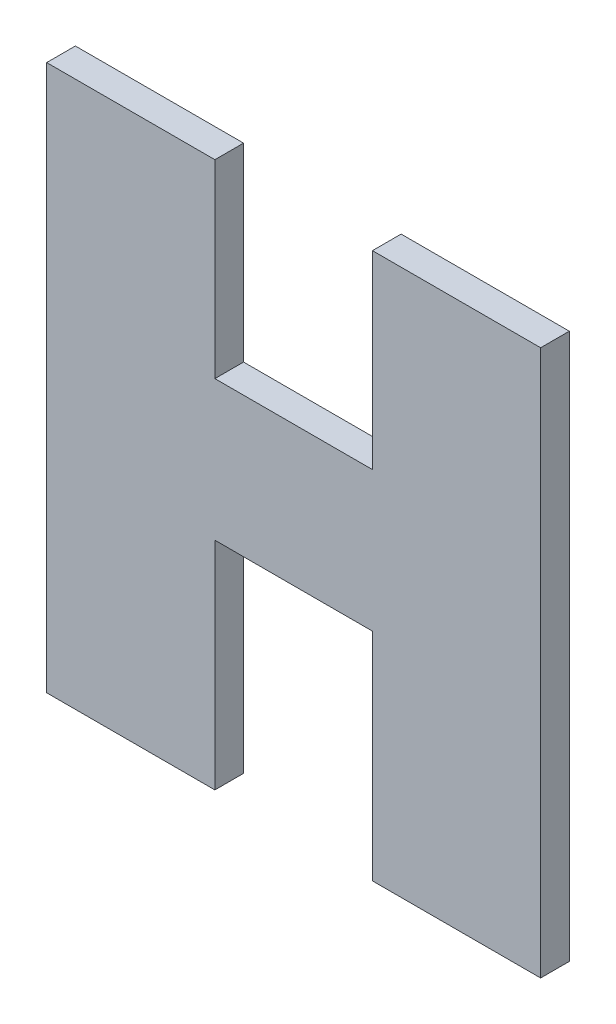
ISO-10303-21;
HEADER;
FILE_DESCRIPTION(('STEP AP214'),'2;1');
FILE_NAME('part.step','',(''),(''),'','','');
FILE_SCHEMA(('AUTOMOTIVE_DESIGN { 1 0 10303 214 1 1 1 1 }'));
ENDSEC;
DATA;
#1=APPLICATION_CONTEXT('core data for automotive mechanical design processes');
#2=APPLICATION_PROTOCOL_DEFINITION('international standard','automotive_design',2000,#1);
#3=PRODUCT_CONTEXT('',#1,'mechanical');
#4=PRODUCT('Part','Part','',(#3));
#5=PRODUCT_RELATED_PRODUCT_CATEGORY('part','',(#4));
#6=PRODUCT_DEFINITION_FORMATION('','',#4);
#7=PRODUCT_DEFINITION_CONTEXT('part definition',#1,'design');
#8=PRODUCT_DEFINITION('design','',#6,#7);
#9=PRODUCT_DEFINITION_SHAPE('','',#8);
#10=(LENGTH_UNIT() NAMED_UNIT(*) SI_UNIT(.MILLI.,.METRE.));
#11=(NAMED_UNIT(*) PLANE_ANGLE_UNIT() SI_UNIT($,.RADIAN.));
#12=(NAMED_UNIT(*) SI_UNIT($,.STERADIAN.) SOLID_ANGLE_UNIT());
#13=UNCERTAINTY_MEASURE_WITH_UNIT(LENGTH_MEASURE(1.E-05),#10,'distance_accuracy_value','');
#14=(GEOMETRIC_REPRESENTATION_CONTEXT(3) GLOBAL_UNCERTAINTY_ASSIGNED_CONTEXT((#13)) GLOBAL_UNIT_ASSIGNED_CONTEXT((#10,
#11,#12)) REPRESENTATION_CONTEXT('',''));
#15=CARTESIAN_POINT('',(0.,0.,0.));
#16=DIRECTION('',(0.,0.,1.));
#17=DIRECTION('',(1.,0.,0.));
#18=AXIS2_PLACEMENT_3D('',#15,#16,#17);
#19=CARTESIAN_POINT('',(0.,0.,0.));
#20=DIRECTION('',(0.,0.,1.));
#21=DIRECTION('',(1.,0.,0.));
#22=AXIS2_PLACEMENT_3D('',#19,#20,#21);
#23=PLANE('',#22);
#24=DIRECTION('',(0.,1.,0.));
#25=VECTOR('',#24,1.);
#26=CARTESIAN_POINT('',(5.04063,-1.367028,0.));
#27=LINE('',#26,#25);
#28=CARTESIAN_POINT('',(5.04063,-1.367028,0.));
#29=VERTEX_POINT('',#28);
#30=CARTESIAN_POINT('',(5.04063,-1.743964,0.));
#31=VERTEX_POINT('',#30);
#32=EDGE_CURVE('E162',#29,#31,#27,.F.);
#33=ORIENTED_EDGE('',*,*,#32,.F.);
#34=DIRECTION('',(1.,0.,0.));
#35=VECTOR('',#34,1.);
#36=CARTESIAN_POINT('',(4.766056,-1.367028,0.));
#37=LINE('',#36,#35);
#38=CARTESIAN_POINT('',(4.766056,-1.367028,0.));
#39=VERTEX_POINT('',#38);
#40=EDGE_CURVE('E157',#39,#29,#37,.T.);
#41=ORIENTED_EDGE('',*,*,#40,.F.);
#42=DIRECTION('',(0.,1.,0.));
#43=VECTOR('',#42,1.);
#44=CARTESIAN_POINT('',(4.766056,-1.743964,0.));
#45=LINE('',#44,#43);
#46=CARTESIAN_POINT('',(4.766056,-1.743964,0.));
#47=VERTEX_POINT('',#46);
#48=EDGE_CURVE('E152',#47,#39,#45,.T.);
#49=ORIENTED_EDGE('',*,*,#48,.F.);
#50=DIRECTION('',(1.,0.,0.));
#51=VECTOR('',#50,1.);
#52=CARTESIAN_POINT('',(4.47294,-1.743964,0.));
#53=LINE('',#52,#51);
#54=CARTESIAN_POINT('',(4.47294,-1.743964,0.));
#55=VERTEX_POINT('',#54);
#56=EDGE_CURVE('E147',#55,#47,#53,.T.);
#57=ORIENTED_EDGE('',*,*,#56,.F.);
#58=DIRECTION('',(0.,1.,0.));
#59=VECTOR('',#58,1.);
#60=CARTESIAN_POINT('',(4.47294,-0.792734,0.));
#61=LINE('',#60,#59);
#62=CARTESIAN_POINT('',(4.47294,-0.792734,0.));
#63=VERTEX_POINT('',#62);
#64=EDGE_CURVE('E142',#63,#55,#61,.F.);
#65=ORIENTED_EDGE('',*,*,#64,.F.);
#66=DIRECTION('',(1.,0.,0.));
#67=VECTOR('',#66,1.);
#68=CARTESIAN_POINT('',(4.766056,-0.792734,0.));
#69=LINE('',#68,#67);
#70=CARTESIAN_POINT('',(4.766056,-0.792734,0.));
#71=VERTEX_POINT('',#70);
#72=EDGE_CURVE('E137',#71,#63,#69,.F.);
#73=ORIENTED_EDGE('',*,*,#72,.F.);
#74=DIRECTION('',(0.,1.,0.));
#75=VECTOR('',#74,1.);
#76=CARTESIAN_POINT('',(4.766056,-1.123188,0.));
#77=LINE('',#76,#75);
#78=CARTESIAN_POINT('',(4.766056,-1.123188,0.));
#79=VERTEX_POINT('',#78);
#80=EDGE_CURVE('E132',#79,#71,#77,.T.);
#81=ORIENTED_EDGE('',*,*,#80,.F.);
#82=DIRECTION('',(1.,0.,0.));
#83=VECTOR('',#82,1.);
#84=CARTESIAN_POINT('',(5.04063,-1.123188,0.));
#85=LINE('',#84,#83);
#86=CARTESIAN_POINT('',(5.04063,-1.123188,0.));
#87=VERTEX_POINT('',#86);
#88=EDGE_CURVE('E118',#87,#79,#85,.F.);
#89=ORIENTED_EDGE('',*,*,#88,.F.);
#90=DIRECTION('',(0.,1.,0.));
#91=VECTOR('',#90,1.);
#92=CARTESIAN_POINT('',(5.04063,-0.792734,0.));
#93=LINE('',#92,#91);
#94=CARTESIAN_POINT('',(5.04063,-0.792734,0.));
#95=VERTEX_POINT('',#94);
#96=EDGE_CURVE('E103',#95,#87,#93,.F.);
#97=ORIENTED_EDGE('',*,*,#96,.F.);
#98=DIRECTION('',(1.,0.,0.));
#99=VECTOR('',#98,1.);
#100=CARTESIAN_POINT('',(5.333746,-0.792734,0.));
#101=LINE('',#100,#99);
#102=CARTESIAN_POINT('',(5.333746,-0.792734,0.));
#103=VERTEX_POINT('',#102);
#104=EDGE_CURVE('E20',#103,#95,#101,.F.);
#105=ORIENTED_EDGE('',*,*,#104,.F.);
#106=DIRECTION('',(0.,1.,0.));
#107=VECTOR('',#106,1.);
#108=CARTESIAN_POINT('',(5.333746,-1.743964,0.));
#109=LINE('',#108,#107);
#110=CARTESIAN_POINT('',(5.333746,-1.743964,0.));
#111=VERTEX_POINT('',#110);
#112=EDGE_CURVE('E171',#111,#103,#109,.T.);
#113=ORIENTED_EDGE('',*,*,#112,.F.);
#114=DIRECTION('',(1.,0.,0.));
#115=VECTOR('',#114,1.);
#116=CARTESIAN_POINT('',(5.04063,-1.743964,0.));
#117=LINE('',#116,#115);
#118=EDGE_CURVE('E167',#31,#111,#117,.T.);
#119=ORIENTED_EDGE('',*,*,#118,.F.);
#120=EDGE_LOOP('',(#33,#41,#49,#57,#65,#73,#81,#89,#97,#105,#113,#119));
#121=FACE_BOUND('',#120,.T.);
#122=ADVANCED_FACE('F17',(#121),#23,.F.);
#123=CARTESIAN_POINT('',(5.333746,-0.792734,0.));
#124=DIRECTION('',(0.,1.,0.));
#125=DIRECTION('',(0.,0.,1.));
#126=AXIS2_PLACEMENT_3D('',#123,#124,#125);
#127=PLANE('',#126);
#128=DIRECTION('',(0.,0.,-1.));
#129=VECTOR('',#128,1.);
#130=CARTESIAN_POINT('',(5.333746,-0.792734,0.));
#131=LINE('',#130,#129);
#132=CARTESIAN_POINT('',(5.333746,-0.792734,0.05));
#133=VERTEX_POINT('',#132);
#134=EDGE_CURVE('E112',#103,#133,#131,.F.);
#135=ORIENTED_EDGE('',*,*,#134,.F.);
#136=ORIENTED_EDGE('',*,*,#104,.T.);
#137=DIRECTION('',(0.,0.,1.));
#138=VECTOR('',#137,1.);
#139=CARTESIAN_POINT('',(5.04063,-0.792734,0.));
#140=LINE('',#139,#138);
#141=CARTESIAN_POINT('',(5.04063,-0.792734,0.05));
#142=VERTEX_POINT('',#141);
#143=EDGE_CURVE('E109',#142,#95,#140,.F.);
#144=ORIENTED_EDGE('',*,*,#143,.F.);
#145=DIRECTION('',(1.,0.,0.));
#146=VECTOR('',#145,1.);
#147=CARTESIAN_POINT('',(0.,-0.792734,0.05));
#148=LINE('',#147,#146);
#149=EDGE_CURVE('E173',#133,#142,#148,.F.);
#150=ORIENTED_EDGE('',*,*,#149,.F.);
#151=EDGE_LOOP('',(#135,#136,#144,#150));
#152=FACE_BOUND('',#151,.T.);
#153=ADVANCED_FACE('F108',(#152),#127,.T.);
#154=CARTESIAN_POINT('',(5.04063,-0.792734,0.));
#155=DIRECTION('',(-1.,0.,0.));
#156=DIRECTION('',(0.,0.,1.));
#157=AXIS2_PLACEMENT_3D('',#154,#155,#156);
#158=PLANE('',#157);
#159=ORIENTED_EDGE('',*,*,#143,.T.);
#160=ORIENTED_EDGE('',*,*,#96,.T.);
#161=DIRECTION('',(0.,0.,1.));
#162=VECTOR('',#161,1.);
#163=CARTESIAN_POINT('',(5.04063,-1.123188,0.));
#164=LINE('',#163,#162);
#165=CARTESIAN_POINT('',(5.04063,-1.123188,0.05));
#166=VERTEX_POINT('',#165);
#167=EDGE_CURVE('E120',#166,#87,#164,.F.);
#168=ORIENTED_EDGE('',*,*,#167,.F.);
#169=DIRECTION('',(0.,1.,0.));
#170=VECTOR('',#169,1.);
#171=CARTESIAN_POINT('',(5.04063,0.,0.05));
#172=LINE('',#171,#170);
#173=EDGE_CURVE('E124',#142,#166,#172,.F.);
#174=ORIENTED_EDGE('',*,*,#173,.F.);
#175=EDGE_LOOP('',(#159,#160,#168,#174));
#176=FACE_BOUND('',#175,.T.);
#177=ADVANCED_FACE('F122',(#176),#158,.T.);
#178=CARTESIAN_POINT('',(5.04063,-1.123188,0.));
#179=DIRECTION('',(0.,1.,0.));
#180=DIRECTION('',(0.,0.,1.));
#181=AXIS2_PLACEMENT_3D('',#178,#179,#180);
#182=PLANE('',#181);
#183=ORIENTED_EDGE('',*,*,#167,.T.);
#184=ORIENTED_EDGE('',*,*,#88,.T.);
#185=DIRECTION('',(0.,0.,-1.));
#186=VECTOR('',#185,1.);
#187=CARTESIAN_POINT('',(4.766056,-1.123188,0.));
#188=LINE('',#187,#186);
#189=CARTESIAN_POINT('',(4.766056,-1.123188,0.05));
#190=VERTEX_POINT('',#189);
#191=EDGE_CURVE('E129',#190,#79,#188,.T.);
#192=ORIENTED_EDGE('',*,*,#191,.F.);
#193=DIRECTION('',(1.,0.,0.));
#194=VECTOR('',#193,1.);
#195=CARTESIAN_POINT('',(0.,-1.123188,0.05));
#196=LINE('',#195,#194);
#197=EDGE_CURVE('E176',#166,#190,#196,.F.);
#198=ORIENTED_EDGE('',*,*,#197,.F.);
#199=EDGE_LOOP('',(#183,#184,#192,#198));
#200=FACE_BOUND('',#199,.T.);
#201=ADVANCED_FACE('F246',(#200),#182,.T.);
#202=CARTESIAN_POINT('',(4.766056,-1.123188,0.));
#203=DIRECTION('',(1.,0.,0.));
#204=DIRECTION('',(0.,0.,-1.));
#205=AXIS2_PLACEMENT_3D('',#202,#203,#204);
#206=PLANE('',#205);
#207=ORIENTED_EDGE('',*,*,#191,.T.);
#208=ORIENTED_EDGE('',*,*,#80,.T.);
#209=DIRECTION('',(0.,0.,1.));
#210=VECTOR('',#209,1.);
#211=CARTESIAN_POINT('',(4.766056,-0.792734,0.));
#212=LINE('',#211,#210);
#213=CARTESIAN_POINT('',(4.766056,-0.792734,0.05));
#214=VERTEX_POINT('',#213);
#215=EDGE_CURVE('E134',#214,#71,#212,.F.);
#216=ORIENTED_EDGE('',*,*,#215,.F.);
#217=DIRECTION('',(0.,1.,0.));
#218=VECTOR('',#217,1.);
#219=CARTESIAN_POINT('',(4.766056,0.,0.05));
#220=LINE('',#219,#218);
#221=EDGE_CURVE('E179',#190,#214,#220,.T.);
#222=ORIENTED_EDGE('',*,*,#221,.F.);
#223=EDGE_LOOP('',(#207,#208,#216,#222));
#224=FACE_BOUND('',#223,.T.);
#225=ADVANCED_FACE('F242',(#224),#206,.T.);
#226=CARTESIAN_POINT('',(4.766056,-0.792734,0.));
#227=DIRECTION('',(0.,1.,0.));
#228=DIRECTION('',(0.,0.,1.));
#229=AXIS2_PLACEMENT_3D('',#226,#227,#228);
#230=PLANE('',#229);
#231=ORIENTED_EDGE('',*,*,#215,.T.);
#232=ORIENTED_EDGE('',*,*,#72,.T.);
#233=DIRECTION('',(0.,0.,1.));
#234=VECTOR('',#233,1.);
#235=CARTESIAN_POINT('',(4.47294,-0.792734,0.));
#236=LINE('',#235,#234);
#237=CARTESIAN_POINT('',(4.47294,-0.792734,0.05));
#238=VERTEX_POINT('',#237);
#239=EDGE_CURVE('E139',#238,#63,#236,.F.);
#240=ORIENTED_EDGE('',*,*,#239,.F.);
#241=DIRECTION('',(1.,0.,0.));
#242=VECTOR('',#241,1.);
#243=CARTESIAN_POINT('',(0.,-0.792734,0.05));
#244=LINE('',#243,#242);
#245=EDGE_CURVE('E182',#214,#238,#244,.F.);
#246=ORIENTED_EDGE('',*,*,#245,.F.);
#247=EDGE_LOOP('',(#231,#232,#240,#246));
#248=FACE_BOUND('',#247,.T.);
#249=ADVANCED_FACE('F238',(#248),#230,.T.);
#250=CARTESIAN_POINT('',(4.47294,-0.792734,0.));
#251=DIRECTION('',(-1.,0.,0.));
#252=DIRECTION('',(0.,0.,1.));
#253=AXIS2_PLACEMENT_3D('',#250,#251,#252);
#254=PLANE('',#253);
#255=ORIENTED_EDGE('',*,*,#239,.T.);
#256=ORIENTED_EDGE('',*,*,#64,.T.);
#257=DIRECTION('',(0.,0.,-1.));
#258=VECTOR('',#257,1.);
#259=CARTESIAN_POINT('',(4.47294,-1.743964,0.));
#260=LINE('',#259,#258);
#261=CARTESIAN_POINT('',(4.47294,-1.743964,0.05));
#262=VERTEX_POINT('',#261);
#263=EDGE_CURVE('E144',#262,#55,#260,.T.);
#264=ORIENTED_EDGE('',*,*,#263,.F.);
#265=DIRECTION('',(0.,1.,0.));
#266=VECTOR('',#265,1.);
#267=CARTESIAN_POINT('',(4.47294,0.,0.05));
#268=LINE('',#267,#266);
#269=EDGE_CURVE('E185',#238,#262,#268,.F.);
#270=ORIENTED_EDGE('',*,*,#269,.F.);
#271=EDGE_LOOP('',(#255,#256,#264,#270));
#272=FACE_BOUND('',#271,.T.);
#273=ADVANCED_FACE('F234',(#272),#254,.T.);
#274=CARTESIAN_POINT('',(4.47294,-1.743964,0.));
#275=DIRECTION('',(0.,-1.,0.));
#276=DIRECTION('',(0.,0.,-1.));
#277=AXIS2_PLACEMENT_3D('',#274,#275,#276);
#278=PLANE('',#277);
#279=ORIENTED_EDGE('',*,*,#263,.T.);
#280=ORIENTED_EDGE('',*,*,#56,.T.);
#281=DIRECTION('',(0.,0.,-1.));
#282=VECTOR('',#281,1.);
#283=CARTESIAN_POINT('',(4.766056,-1.743964,0.));
#284=LINE('',#283,#282);
#285=CARTESIAN_POINT('',(4.766056,-1.743964,0.05));
#286=VERTEX_POINT('',#285);
#287=EDGE_CURVE('E149',#286,#47,#284,.T.);
#288=ORIENTED_EDGE('',*,*,#287,.F.);
#289=DIRECTION('',(1.,0.,0.));
#290=VECTOR('',#289,1.);
#291=CARTESIAN_POINT('',(0.,-1.743964,0.05));
#292=LINE('',#291,#290);
#293=EDGE_CURVE('E188',#262,#286,#292,.T.);
#294=ORIENTED_EDGE('',*,*,#293,.F.);
#295=EDGE_LOOP('',(#279,#280,#288,#294));
#296=FACE_BOUND('',#295,.T.);
#297=ADVANCED_FACE('F230',(#296),#278,.T.);
#298=CARTESIAN_POINT('',(4.766056,-1.743964,0.));
#299=DIRECTION('',(1.,0.,0.));
#300=DIRECTION('',(0.,0.,-1.));
#301=AXIS2_PLACEMENT_3D('',#298,#299,#300);
#302=PLANE('',#301);
#303=ORIENTED_EDGE('',*,*,#287,.T.);
#304=ORIENTED_EDGE('',*,*,#48,.T.);
#305=DIRECTION('',(0.,0.,-1.));
#306=VECTOR('',#305,1.);
#307=CARTESIAN_POINT('',(4.766056,-1.367028,0.));
#308=LINE('',#307,#306);
#309=CARTESIAN_POINT('',(4.766056,-1.367028,0.05));
#310=VERTEX_POINT('',#309);
#311=EDGE_CURVE('E154',#310,#39,#308,.T.);
#312=ORIENTED_EDGE('',*,*,#311,.F.);
#313=DIRECTION('',(0.,1.,0.));
#314=VECTOR('',#313,1.);
#315=CARTESIAN_POINT('',(4.766056,0.,0.05));
#316=LINE('',#315,#314);
#317=EDGE_CURVE('E191',#286,#310,#316,.T.);
#318=ORIENTED_EDGE('',*,*,#317,.F.);
#319=EDGE_LOOP('',(#303,#304,#312,#318));
#320=FACE_BOUND('',#319,.T.);
#321=ADVANCED_FACE('F226',(#320),#302,.T.);
#322=CARTESIAN_POINT('',(4.766056,-1.367028,0.));
#323=DIRECTION('',(0.,-1.,0.));
#324=DIRECTION('',(0.,0.,-1.));
#325=AXIS2_PLACEMENT_3D('',#322,#323,#324);
#326=PLANE('',#325);
#327=ORIENTED_EDGE('',*,*,#311,.T.);
#328=ORIENTED_EDGE('',*,*,#40,.T.);
#329=DIRECTION('',(0.,0.,1.));
#330=VECTOR('',#329,1.);
#331=CARTESIAN_POINT('',(5.04063,-1.367028,0.));
#332=LINE('',#331,#330);
#333=CARTESIAN_POINT('',(5.04063,-1.367028,0.05));
#334=VERTEX_POINT('',#333);
#335=EDGE_CURVE('E159',#334,#29,#332,.F.);
#336=ORIENTED_EDGE('',*,*,#335,.F.);
#337=DIRECTION('',(1.,0.,0.));
#338=VECTOR('',#337,1.);
#339=CARTESIAN_POINT('',(0.,-1.367028,0.05));
#340=LINE('',#339,#338);
#341=EDGE_CURVE('E194',#310,#334,#340,.T.);
#342=ORIENTED_EDGE('',*,*,#341,.F.);
#343=EDGE_LOOP('',(#327,#328,#336,#342));
#344=FACE_BOUND('',#343,.T.);
#345=ADVANCED_FACE('F223',(#344),#326,.T.);
#346=CARTESIAN_POINT('',(5.04063,-1.367028,0.));
#347=DIRECTION('',(-1.,0.,0.));
#348=DIRECTION('',(0.,0.,1.));
#349=AXIS2_PLACEMENT_3D('',#346,#347,#348);
#350=PLANE('',#349);
#351=ORIENTED_EDGE('',*,*,#335,.T.);
#352=ORIENTED_EDGE('',*,*,#32,.T.);
#353=DIRECTION('',(0.,0.,-1.));
#354=VECTOR('',#353,1.);
#355=CARTESIAN_POINT('',(5.04063,-1.743964,0.));
#356=LINE('',#355,#354);
#357=CARTESIAN_POINT('',(5.04063,-1.743964,0.05));
#358=VERTEX_POINT('',#357);
#359=EDGE_CURVE('E164',#358,#31,#356,.T.);
#360=ORIENTED_EDGE('',*,*,#359,.F.);
#361=DIRECTION('',(0.,1.,0.));
#362=VECTOR('',#361,1.);
#363=CARTESIAN_POINT('',(5.04063,0.,0.05));
#364=LINE('',#363,#362);
#365=EDGE_CURVE('E197',#334,#358,#364,.F.);
#366=ORIENTED_EDGE('',*,*,#365,.F.);
#367=EDGE_LOOP('',(#351,#352,#360,#366));
#368=FACE_BOUND('',#367,.T.);
#369=ADVANCED_FACE('F207',(#368),#350,.T.);
#370=CARTESIAN_POINT('',(5.04063,-1.743964,0.));
#371=DIRECTION('',(0.,-1.,0.));
#372=DIRECTION('',(0.,0.,-1.));
#373=AXIS2_PLACEMENT_3D('',#370,#371,#372);
#374=PLANE('',#373);
#375=ORIENTED_EDGE('',*,*,#359,.T.);
#376=ORIENTED_EDGE('',*,*,#118,.T.);
#377=DIRECTION('',(0.,0.,-1.));
#378=VECTOR('',#377,1.);
#379=CARTESIAN_POINT('',(5.333746,-1.743964,0.));
#380=LINE('',#379,#378);
#381=CARTESIAN_POINT('',(5.333746,-1.743964,0.05));
#382=VERTEX_POINT('',#381);
#383=EDGE_CURVE('E35',#382,#111,#380,.T.);
#384=ORIENTED_EDGE('',*,*,#383,.F.);
#385=DIRECTION('',(1.,0.,0.));
#386=VECTOR('',#385,1.);
#387=CARTESIAN_POINT('',(0.,-1.743964,0.05));
#388=LINE('',#387,#386);
#389=EDGE_CURVE('E26',#358,#382,#388,.T.);
#390=ORIENTED_EDGE('',*,*,#389,.F.);
#391=EDGE_LOOP('',(#375,#376,#384,#390));
#392=FACE_BOUND('',#391,.T.);
#393=ADVANCED_FACE('F204',(#392),#374,.T.);
#394=CARTESIAN_POINT('',(5.333746,-1.743964,0.));
#395=DIRECTION('',(1.,0.,0.));
#396=DIRECTION('',(0.,0.,-1.));
#397=AXIS2_PLACEMENT_3D('',#394,#395,#396);
#398=PLANE('',#397);
#399=ORIENTED_EDGE('',*,*,#383,.T.);
#400=ORIENTED_EDGE('',*,*,#112,.T.);
#401=ORIENTED_EDGE('',*,*,#134,.T.);
#402=DIRECTION('',(0.,1.,0.));
#403=VECTOR('',#402,1.);
#404=CARTESIAN_POINT('',(5.333746,0.,0.05));
#405=LINE('',#404,#403);
#406=EDGE_CURVE('E11',#382,#133,#405,.T.);
#407=ORIENTED_EDGE('',*,*,#406,.F.);
#408=EDGE_LOOP('',(#399,#400,#401,#407));
#409=FACE_BOUND('',#408,.T.);
#410=ADVANCED_FACE('F210',(#409),#398,.T.);
#411=CARTESIAN_POINT('',(0.,0.,0.05));
#412=DIRECTION('',(0.,0.,1.));
#413=DIRECTION('',(1.,0.,0.));
#414=AXIS2_PLACEMENT_3D('',#411,#412,#413);
#415=PLANE('',#414);
#416=ORIENTED_EDGE('',*,*,#389,.T.);
#417=ORIENTED_EDGE('',*,*,#406,.T.);
#418=ORIENTED_EDGE('',*,*,#149,.T.);
#419=ORIENTED_EDGE('',*,*,#173,.T.);
#420=ORIENTED_EDGE('',*,*,#197,.T.);
#421=ORIENTED_EDGE('',*,*,#221,.T.);
#422=ORIENTED_EDGE('',*,*,#245,.T.);
#423=ORIENTED_EDGE('',*,*,#269,.T.);
#424=ORIENTED_EDGE('',*,*,#293,.T.);
#425=ORIENTED_EDGE('',*,*,#317,.T.);
#426=ORIENTED_EDGE('',*,*,#341,.T.);
#427=ORIENTED_EDGE('',*,*,#365,.T.);
#428=EDGE_LOOP('',(#416,#417,#418,#419,#420,#421,#422,#423,#424,#425,#426,#427));
#429=FACE_BOUND('',#428,.T.);
#430=ADVANCED_FACE('F202',(#429),#415,.T.);
#431=CLOSED_SHELL('',(#122,#153,#177,#201,#225,#249,#273,#297,#321,#345,#369,#393,#410,#430));
#432=MANIFOLD_SOLID_BREP('B1',#431);
#433=ADVANCED_BREP_SHAPE_REPRESENTATION('',(#18,#432),#14);
#434=SHAPE_DEFINITION_REPRESENTATION(#9,#433);
ENDSEC;
END-ISO-10303-21;
